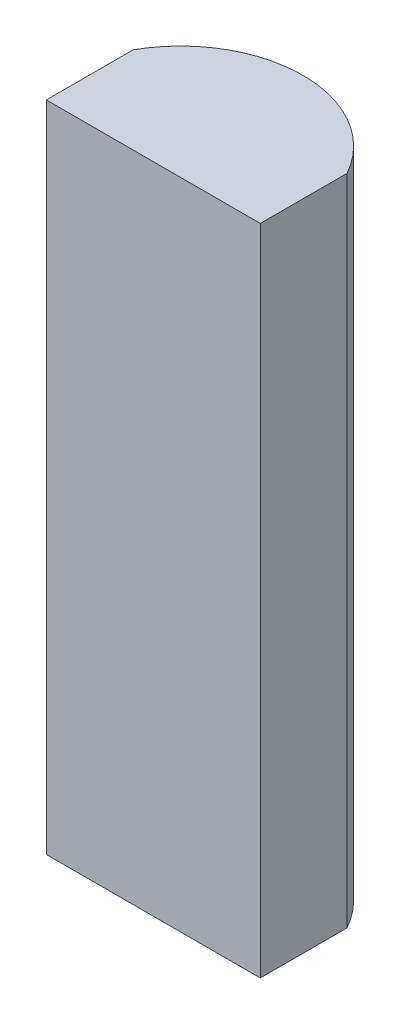
ISO-10303-21;
HEADER;
FILE_DESCRIPTION(('STEP AP214'),'2;1');
FILE_NAME('part.step','',(''),(''),'','','');
FILE_SCHEMA(('AUTOMOTIVE_DESIGN { 1 0 10303 214 1 1 1 1 }'));
ENDSEC;
DATA;
#1=APPLICATION_CONTEXT('core data for automotive mechanical design processes');
#2=APPLICATION_PROTOCOL_DEFINITION('international standard','automotive_design',2000,#1);
#3=PRODUCT_CONTEXT('',#1,'mechanical');
#4=PRODUCT('Part','Part','',(#3));
#5=PRODUCT_RELATED_PRODUCT_CATEGORY('part','',(#4));
#6=PRODUCT_DEFINITION_FORMATION('','',#4);
#7=PRODUCT_DEFINITION_CONTEXT('part definition',#1,'design');
#8=PRODUCT_DEFINITION('design','',#6,#7);
#9=PRODUCT_DEFINITION_SHAPE('','',#8);
#10=(LENGTH_UNIT() NAMED_UNIT(*) SI_UNIT(.MILLI.,.METRE.));
#11=(NAMED_UNIT(*) PLANE_ANGLE_UNIT() SI_UNIT($,.RADIAN.));
#12=(NAMED_UNIT(*) SI_UNIT($,.STERADIAN.) SOLID_ANGLE_UNIT());
#13=UNCERTAINTY_MEASURE_WITH_UNIT(LENGTH_MEASURE(1.E-05),#10,'distance_accuracy_value','');
#14=(GEOMETRIC_REPRESENTATION_CONTEXT(3) GLOBAL_UNCERTAINTY_ASSIGNED_CONTEXT((#13)) GLOBAL_UNIT_ASSIGNED_CONTEXT((#10,
#11,#12)) REPRESENTATION_CONTEXT('',''));
#15=CARTESIAN_POINT('',(0.,0.,0.));
#16=DIRECTION('',(0.,0.,1.));
#17=DIRECTION('',(1.,0.,0.));
#18=AXIS2_PLACEMENT_3D('',#15,#16,#17);
#19=CARTESIAN_POINT('',(-62.2,380.,-34.6496753231542));
#20=DIRECTION('',(1.,0.,0.));
#21=DIRECTION('',(0.,0.,-1.));
#22=AXIS2_PLACEMENT_3D('',#19,#20,#21);
#23=PLANE('',#22);
#24=DIRECTION('',(0.,0.,1.));
#25=VECTOR('',#24,1.);
#26=CARTESIAN_POINT('',(-62.2,0.,-34.6496753231542));
#27=LINE('',#26,#25);
#28=CARTESIAN_POINT('',(-62.2,0.,-34.6496753231542));
#29=VERTEX_POINT('',#28);
#30=CARTESIAN_POINT('',(-62.2,0.,15.8));
#31=VERTEX_POINT('',#30);
#32=EDGE_CURVE('E109',#29,#31,#27,.T.);
#33=ORIENTED_EDGE('',*,*,#32,.T.);
#34=DIRECTION('',(0.,-1.,0.));
#35=VECTOR('',#34,1.);
#36=CARTESIAN_POINT('',(-62.2,380.,15.8));
#37=LINE('',#36,#35);
#38=CARTESIAN_POINT('',(-62.2,380.,15.8));
#39=VERTEX_POINT('',#38);
#40=EDGE_CURVE('E11',#39,#31,#37,.T.);
#41=ORIENTED_EDGE('',*,*,#40,.F.);
#42=DIRECTION('',(0.,0.,1.));
#43=VECTOR('',#42,1.);
#44=CARTESIAN_POINT('',(-62.2,380.,-34.6496753231542));
#45=LINE('',#44,#43);
#46=CARTESIAN_POINT('',(-62.2,380.,-34.6496753231542));
#47=VERTEX_POINT('',#46);
#48=EDGE_CURVE('E93',#47,#39,#45,.T.);
#49=ORIENTED_EDGE('',*,*,#48,.F.);
#50=DIRECTION('',(0.,-1.,0.));
#51=VECTOR('',#50,1.);
#52=CARTESIAN_POINT('',(-62.2,380.,-34.6496753231542));
#53=LINE('',#52,#51);
#54=EDGE_CURVE('E105',#47,#29,#53,.T.);
#55=ORIENTED_EDGE('',*,*,#54,.T.);
#56=EDGE_LOOP('',(#33,#41,#49,#55));
#57=FACE_BOUND('',#56,.T.);
#58=ADVANCED_FACE('F41',(#57),#23,.F.);
#59=CARTESIAN_POINT('',(-62.2,380.,15.8));
#60=DIRECTION('',(0.,0.,-1.));
#61=DIRECTION('',(-1.,0.,0.));
#62=AXIS2_PLACEMENT_3D('',#59,#60,#61);
#63=PLANE('',#62);
#64=DIRECTION('',(1.,0.,0.));
#65=VECTOR('',#64,1.);
#66=CARTESIAN_POINT('',(-62.2,0.,15.8));
#67=LINE('',#66,#65);
#68=CARTESIAN_POINT('',(62.2,0.,15.8));
#69=VERTEX_POINT('',#68);
#70=EDGE_CURVE('E98',#31,#69,#67,.T.);
#71=ORIENTED_EDGE('',*,*,#70,.T.);
#72=DIRECTION('',(0.,-1.,0.));
#73=VECTOR('',#72,1.);
#74=CARTESIAN_POINT('',(62.2,380.,15.8));
#75=LINE('',#74,#73);
#76=CARTESIAN_POINT('',(62.2,380.,15.8));
#77=VERTEX_POINT('',#76);
#78=EDGE_CURVE('E50',#77,#69,#75,.T.);
#79=ORIENTED_EDGE('',*,*,#78,.F.);
#80=DIRECTION('',(1.,0.,0.));
#81=VECTOR('',#80,1.);
#82=CARTESIAN_POINT('',(-62.2,380.,15.8));
#83=LINE('',#82,#81);
#84=EDGE_CURVE('E88',#39,#77,#83,.T.);
#85=ORIENTED_EDGE('',*,*,#84,.F.);
#86=ORIENTED_EDGE('',*,*,#40,.T.);
#87=EDGE_LOOP('',(#71,#79,#85,#86));
#88=FACE_BOUND('',#87,.T.);
#89=ADVANCED_FACE('F97',(#88),#63,.F.);
#90=CARTESIAN_POINT('',(62.2,380.,15.8));
#91=DIRECTION('',(-1.,0.,0.));
#92=DIRECTION('',(0.,0.,1.));
#93=AXIS2_PLACEMENT_3D('',#90,#91,#92);
#94=PLANE('',#93);
#95=DIRECTION('',(0.,0.,-1.));
#96=VECTOR('',#95,1.);
#97=CARTESIAN_POINT('',(62.2,0.,15.8));
#98=LINE('',#97,#96);
#99=CARTESIAN_POINT('',(62.2,0.,-34.6496753231542));
#100=VERTEX_POINT('',#99);
#101=EDGE_CURVE('E75',#69,#100,#98,.T.);
#102=ORIENTED_EDGE('',*,*,#101,.T.);
#103=DIRECTION('',(0.,-1.,0.));
#104=VECTOR('',#103,1.);
#105=CARTESIAN_POINT('',(62.2,380.,-34.6496753231542));
#106=LINE('',#105,#104);
#107=CARTESIAN_POINT('',(62.2,380.,-34.6496753231542));
#108=VERTEX_POINT('',#107);
#109=EDGE_CURVE('E100',#108,#100,#106,.T.);
#110=ORIENTED_EDGE('',*,*,#109,.F.);
#111=DIRECTION('',(0.,0.,-1.));
#112=VECTOR('',#111,1.);
#113=CARTESIAN_POINT('',(62.2,380.,15.8));
#114=LINE('',#113,#112);
#115=EDGE_CURVE('E91',#77,#108,#114,.T.);
#116=ORIENTED_EDGE('',*,*,#115,.F.);
#117=ORIENTED_EDGE('',*,*,#78,.T.);
#118=EDGE_LOOP('',(#102,#110,#116,#117));
#119=FACE_BOUND('',#118,.T.);
#120=ADVANCED_FACE('F101',(#119),#94,.F.);
#121=CARTESIAN_POINT('',(0.,380.,0.));
#122=DIRECTION('',(0.,-1.,0.));
#123=DIRECTION('',(0.,0.,-1.));
#124=AXIS2_PLACEMENT_3D('',#121,#122,#123);
#125=CYLINDRICAL_SURFACE('',#124,71.2);
#126=CARTESIAN_POINT('',(0.,0.,0.));
#127=DIRECTION('',(0.,1.,0.));
#128=DIRECTION('',(0.,0.,1.));
#129=AXIS2_PLACEMENT_3D('',#126,#127,#128);
#130=CIRCLE('',#129,71.2);
#131=EDGE_CURVE('E81',#100,#29,#130,.T.);
#132=ORIENTED_EDGE('',*,*,#131,.T.);
#133=ORIENTED_EDGE('',*,*,#54,.F.);
#134=CARTESIAN_POINT('',(0.,380.,0.));
#135=DIRECTION('',(0.,1.,0.));
#136=DIRECTION('',(0.,0.,1.));
#137=AXIS2_PLACEMENT_3D('',#134,#135,#136);
#138=CIRCLE('',#137,71.2);
#139=EDGE_CURVE('E58',#108,#47,#138,.T.);
#140=ORIENTED_EDGE('',*,*,#139,.F.);
#141=ORIENTED_EDGE('',*,*,#109,.T.);
#142=EDGE_LOOP('',(#132,#133,#140,#141));
#143=FACE_BOUND('',#142,.T.);
#144=ADVANCED_FACE('F122',(#143),#125,.T.);
#145=CARTESIAN_POINT('',(0.,380.,0.));
#146=DIRECTION('',(0.,1.,0.));
#147=DIRECTION('',(0.,0.,1.));
#148=AXIS2_PLACEMENT_3D('',#145,#146,#147);
#149=PLANE('',#148);
#150=ORIENTED_EDGE('',*,*,#48,.T.);
#151=ORIENTED_EDGE('',*,*,#84,.T.);
#152=ORIENTED_EDGE('',*,*,#115,.T.);
#153=ORIENTED_EDGE('',*,*,#139,.T.);
#154=EDGE_LOOP('',(#150,#151,#152,#153));
#155=FACE_BOUND('',#154,.T.);
#156=ADVANCED_FACE('F89',(#155),#149,.T.);
#157=CARTESIAN_POINT('',(0.,0.,0.));
#158=DIRECTION('',(0.,1.,0.));
#159=DIRECTION('',(0.,0.,1.));
#160=AXIS2_PLACEMENT_3D('',#157,#158,#159);
#161=PLANE('',#160);
#162=ORIENTED_EDGE('',*,*,#32,.F.);
#163=ORIENTED_EDGE('',*,*,#131,.F.);
#164=ORIENTED_EDGE('',*,*,#101,.F.);
#165=ORIENTED_EDGE('',*,*,#70,.F.);
#166=EDGE_LOOP('',(#162,#163,#164,#165));
#167=FACE_BOUND('',#166,.T.);
#168=ADVANCED_FACE('F125',(#167),#161,.F.);
#169=CLOSED_SHELL('',(#58,#89,#120,#144,#156,#168));
#170=MANIFOLD_SOLID_BREP('B2',#169);
#171=ADVANCED_BREP_SHAPE_REPRESENTATION('',(#18,#170),#14);
#172=SHAPE_DEFINITION_REPRESENTATION(#9,#171);
ENDSEC;
END-ISO-10303-21;
